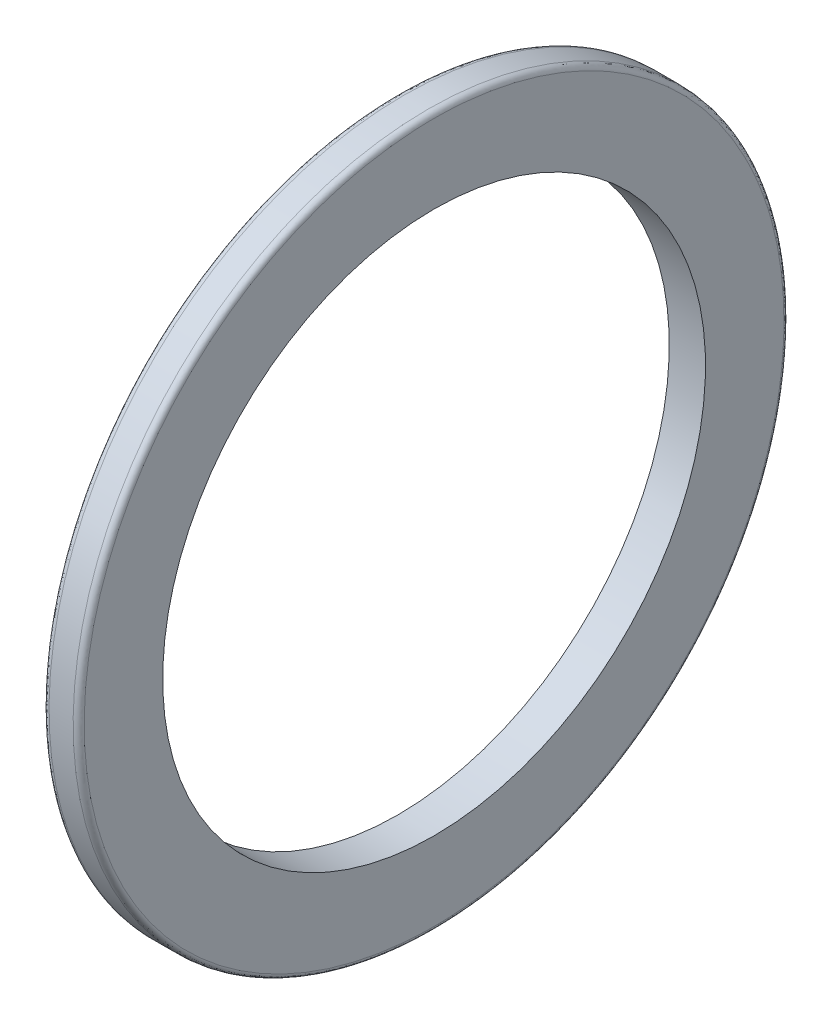
ISO-10303-21;
HEADER;
FILE_DESCRIPTION(('STEP AP214'),'2;1');
FILE_NAME('part.step','',(''),(''),'','','');
FILE_SCHEMA(('AUTOMOTIVE_DESIGN { 1 0 10303 214 1 1 1 1 }'));
ENDSEC;
DATA;
#1=APPLICATION_CONTEXT('core data for automotive mechanical design processes');
#2=APPLICATION_PROTOCOL_DEFINITION('international standard','automotive_design',2000,#1);
#3=PRODUCT_CONTEXT('',#1,'mechanical');
#4=PRODUCT('Part','Part','',(#3));
#5=PRODUCT_RELATED_PRODUCT_CATEGORY('part','',(#4));
#6=PRODUCT_DEFINITION_FORMATION('','',#4);
#7=PRODUCT_DEFINITION_CONTEXT('part definition',#1,'design');
#8=PRODUCT_DEFINITION('design','',#6,#7);
#9=PRODUCT_DEFINITION_SHAPE('','',#8);
#10=(LENGTH_UNIT() NAMED_UNIT(*) SI_UNIT(.MILLI.,.METRE.));
#11=(NAMED_UNIT(*) PLANE_ANGLE_UNIT() SI_UNIT($,.RADIAN.));
#12=(NAMED_UNIT(*) SI_UNIT($,.STERADIAN.) SOLID_ANGLE_UNIT());
#13=UNCERTAINTY_MEASURE_WITH_UNIT(LENGTH_MEASURE(1.E-05),#10,'distance_accuracy_value','');
#14=(GEOMETRIC_REPRESENTATION_CONTEXT(3) GLOBAL_UNCERTAINTY_ASSIGNED_CONTEXT((#13)) GLOBAL_UNIT_ASSIGNED_CONTEXT((#10,
#11,#12)) REPRESENTATION_CONTEXT('',''));
#15=CARTESIAN_POINT('',(0.,0.,0.));
#16=DIRECTION('',(0.,0.,1.));
#17=DIRECTION('',(1.,0.,0.));
#18=AXIS2_PLACEMENT_3D('',#15,#16,#17);
#19=CARTESIAN_POINT('',(117.623751985414,24.7855765613423,30.5708544442854));
#20=DIRECTION('',(-1.,0.,0.));
#21=DIRECTION('',(0.,1.,0.));
#22=AXIS2_PLACEMENT_3D('',#19,#20,#21);
#23=PLANE('',#22);
#24=CARTESIAN_POINT('',(117.623751985414,26.1058697660205,19.9562775900885));
#25=DIRECTION('',(-1.,0.,0.));
#26=DIRECTION('',(0.,-0.813826036051076,-0.581108581114918));
#27=AXIS2_PLACEMENT_3D('',#24,#25,#26);
#28=CIRCLE('',#27,8.29700926115299);
#29=CARTESIAN_POINT('',(117.623751985414,34.4028790271735,19.9562775900885));
#30=VERTEX_POINT('',#29);
#31=EDGE_CURVE('E50',#30,#30,#28,.T.);
#32=ORIENTED_EDGE('',*,*,#31,.F.);
#33=EDGE_LOOP('',(#32));
#34=FACE_BOUND('',#33,.T.);
#35=CARTESIAN_POINT('',(117.623751985414,26.1058697660205,19.9562775900885));
#36=DIRECTION('',(1.,0.,0.));
#37=DIRECTION('',(0.,0.476211165360655,0.879330953615217));
#38=AXIS2_PLACEMENT_3D('',#35,#36,#37);
#39=CIRCLE('',#38,10.6963739622347);
#40=CARTESIAN_POINT('',(117.623751985414,24.7855765613423,30.5708544442854));
#41=VERTEX_POINT('',#40);
#42=EDGE_CURVE('E77',#41,#41,#39,.T.);
#43=ORIENTED_EDGE('',*,*,#42,.F.);
#44=EDGE_LOOP('',(#43));
#45=FACE_BOUND('',#44,.T.);
#46=ADVANCED_FACE('F40',(#34,#45),#23,.T.);
#47=CARTESIAN_POINT('',(118.888874461336,26.1058697660205,19.9562775900885));
#48=DIRECTION('',(-1.,0.,0.));
#49=DIRECTION('',(0.,-1.,0.));
#50=AXIS2_PLACEMENT_3D('',#47,#48,#49);
#51=CYLINDRICAL_SURFACE('',#50,8.29700926115298);
#52=ORIENTED_EDGE('',*,*,#31,.T.);
#53=DIRECTION('',(1.,0.,0.));
#54=VECTOR('',#53,1.);
#55=CARTESIAN_POINT('',(118.888874461336,34.4028790271735,19.9562775900885));
#56=LINE('',#55,#54);
#57=CARTESIAN_POINT('',(118.730433843465,34.4028790271735,19.9562775900885));
#58=VERTEX_POINT('',#57);
#59=EDGE_CURVE('E11',#30,#58,#56,.T.);
#60=ORIENTED_EDGE('',*,*,#59,.T.);
#61=CARTESIAN_POINT('',(118.730433843465,26.1058697660205,19.9562775900885));
#62=DIRECTION('',(-1.,0.,0.));
#63=DIRECTION('',(0.,-0.813826036051075,-0.581108581114919));
#64=AXIS2_PLACEMENT_3D('',#61,#62,#63);
#65=CIRCLE('',#64,8.29700926115298);
#66=EDGE_CURVE('E68',#58,#58,#65,.T.);
#67=ORIENTED_EDGE('',*,*,#66,.F.);
#68=ORIENTED_EDGE('',*,*,#59,.F.);
#69=EDGE_LOOP('',(#52,#60,#67,#68));
#70=FACE_BOUND('',#69,.T.);
#71=ADVANCED_FACE('F42',(#70),#51,.F.);
#72=CARTESIAN_POINT('',(118.545682167081,24.7666666288693,30.7228819869787));
#73=CARTESIAN_POINT('',(118.730433843465,24.7666666288693,30.7228819869788));
#74=CARTESIAN_POINT('',(118.730433843465,24.7855765613423,30.5708544442854));
#75=CARTESIAN_POINT('',(118.545682167081,14.0000622319791,29.3836788498275));
#76=CARTESIAN_POINT('',(118.730433843465,14.0000622319791,29.3836788498276));
#77=CARTESIAN_POINT('',(118.730433843465,14.1709997071453,29.2505612396072));
#78=CARTESIAN_POINT('',(118.545682167081,15.3392653691303,18.6170744529373));
#79=CARTESIAN_POINT('',(118.730433843465,15.3392653691303,18.6170744529373));
#80=CARTESIAN_POINT('',(118.730433843465,15.4912929118236,18.6359843854103));
#81=CARTESIAN_POINT('',(118.545682167081,16.6784685062815,7.85047005604708));
#82=CARTESIAN_POINT('',(118.730433843465,16.6784685062815,7.85047005604705));
#83=CARTESIAN_POINT('',(118.730433843465,16.8115861165018,8.02140753121333));
#84=CARTESIAN_POINT('',(118.545682167081,27.4450729031717,9.18967319319828));
#85=CARTESIAN_POINT('',(118.730433843465,27.4450729031717,9.18967319319824));
#86=CARTESIAN_POINT('',(118.730433843465,27.4261629706988,9.34170073589156));
#87=CARTESIAN_POINT('',(118.545682167081,38.211677300062,10.5288763303495));
#88=CARTESIAN_POINT('',(118.730433843465,38.211677300062,10.5288763303495));
#89=CARTESIAN_POINT('',(118.730433843465,38.0407398248957,10.6619939405698));
#90=CARTESIAN_POINT('',(118.545682167081,36.8724741629107,21.2954807272397));
#91=CARTESIAN_POINT('',(118.730433843465,36.8724741629108,21.2954807272397));
#92=CARTESIAN_POINT('',(118.730433843465,36.7204466202175,21.2765707947667));
#93=CARTESIAN_POINT('',(118.545682167081,35.5332710257595,32.0620851241299));
#94=CARTESIAN_POINT('',(118.730433843465,35.5332710257596,32.06208512413));
#95=CARTESIAN_POINT('',(118.730433843465,35.4001534155392,31.8911476489637));
#96=CARTESIAN_POINT('',(118.545682167081,24.7666666288693,30.7228819869787));
#97=CARTESIAN_POINT('',(118.730433843465,24.7666666288693,30.7228819869788));
#98=CARTESIAN_POINT('',(118.730433843465,24.7855765613423,30.5708544442854));
#99=(BOUNDED_SURFACE() B_SPLINE_SURFACE(2,2,((#72,#73,#74),(#75,#76,#77),(#78,#79,#80),(#81,#82,
#83),(#84,#85,#86),(#87,#88,#89),(#90,#91,#92),(#93,#94,#95),(#96,#97,#98)),.UNSPECIFIED.,.T.,
.F.,.F.) B_SPLINE_SURFACE_WITH_KNOTS((3,2,2,2,3),(3,3),(0.,21.9340743027795,43.868148605559,
65.8022229083385,87.7362972111179),(0.,0.31415926535973),
.UNSPECIFIED.) GEOMETRIC_REPRESENTATION_ITEM() RATIONAL_B_SPLINE_SURFACE(((1.,0.707106781186471,
1.),(0.707106781186548,0.499999999999946,0.707106781186548),(1.,0.707106781186471,1.),
(0.707106781186548,0.499999999999946,0.707106781186548),(1.,0.707106781186471,1.),
(0.707106781186548,0.499999999999946,0.707106781186548),(1.,0.707106781186471,1.),
(0.707106781186548,0.499999999999946,0.707106781186548),(1.,0.707106781186471,1.))) REPRESENTATION_ITEM('') SURFACE());
#100=CARTESIAN_POINT('',(118.545682167081,26.1058697660205,19.9562775900885));
#101=DIRECTION('',(1.,0.,0.));
#102=DIRECTION('',(0.,0.476211165360656,0.879330953615217));
#103=AXIS2_PLACEMENT_3D('',#100,#101,#102);
#104=CIRCLE('',#103,10.8495730460554);
#105=CARTESIAN_POINT('',(118.545682167081,24.7666666288693,30.7228819869787));
#106=VERTEX_POINT('',#105);
#107=EDGE_CURVE('E80',#106,#106,#104,.T.);
#108=CARTESIAN_POINT('',(118.545682167081,24.7855765613423,30.5708544442851));
#109=DIRECTION('',(0.,0.992352818971499,0.123433717757022));
#110=DIRECTION('',(1.,-5.57228464769207E-13,4.71705043640603E-12));
#111=AXIS2_PLACEMENT_3D('',#108,#109,#110);
#112=ELLIPSE('',#111,0.184751676383958,0.153199083820986);
#113=CARTESIAN_POINT('',(118.730433843465,24.7855765613423,30.5708544442854));
#114=VERTEX_POINT('',#113);
#115=EDGE_CURVE('E96',#106,#114,#112,.T.);
#116=CARTESIAN_POINT('',(118.730433843465,26.1058697660205,19.9562775900885));
#117=DIRECTION('',(1.,0.,0.));
#118=DIRECTION('',(0.,0.476211165360656,0.879330953615216));
#119=AXIS2_PLACEMENT_3D('',#116,#117,#118);
#120=CIRCLE('',#119,10.6963739622347);
#121=EDGE_CURVE('E74',#114,#114,#120,.T.);
#122=ORIENTED_EDGE('',*,*,#107,.T.);
#123=ORIENTED_EDGE('',*,*,#115,.T.);
#124=ORIENTED_EDGE('',*,*,#121,.F.);
#125=ORIENTED_EDGE('',*,*,#115,.F.);
#126=EDGE_LOOP('',(#122,#123,#124,#125));
#127=FACE_BOUND('',#126,.T.);
#128=ADVANCED_FACE('F103',(#127),#99,.T.);
#129=CARTESIAN_POINT('',(117.808503661797,24.7666666288693,30.7228819869787));
#130=CARTESIAN_POINT('',(117.808503661797,14.0000622319791,29.3836788498275));
#131=CARTESIAN_POINT('',(117.808503661797,15.3392653691303,18.6170744529373));
#132=CARTESIAN_POINT('',(117.808503661797,16.6784685062815,7.85047005604708));
#133=CARTESIAN_POINT('',(117.808503661797,27.4450729031717,9.18967319319828));
#134=CARTESIAN_POINT('',(117.808503661797,38.211677300062,10.5288763303495));
#135=CARTESIAN_POINT('',(117.808503661797,36.8724741629107,21.2954807272397));
#136=CARTESIAN_POINT('',(117.808503661797,35.5332710257595,32.0620851241299));
#137=CARTESIAN_POINT('',(117.808503661797,24.7666666288693,30.7228819869787));
#138=CARTESIAN_POINT('',(117.623751985414,24.7666666288693,30.7228819869788));
#139=CARTESIAN_POINT('',(117.623751985414,14.0000622319791,29.3836788498276));
#140=CARTESIAN_POINT('',(117.623751985414,15.3392653691303,18.6170744529373));
#141=CARTESIAN_POINT('',(117.623751985414,16.6784685062815,7.85047005604706));
#142=CARTESIAN_POINT('',(117.623751985414,27.4450729031717,9.18967319319825));
#143=CARTESIAN_POINT('',(117.623751985414,38.211677300062,10.5288763303495));
#144=CARTESIAN_POINT('',(117.623751985414,36.8724741629108,21.2954807272397));
#145=CARTESIAN_POINT('',(117.623751985414,35.5332710257596,32.0620851241301));
#146=CARTESIAN_POINT('',(117.623751985414,24.7666666288693,30.7228819869788));
#147=CARTESIAN_POINT('',(117.623751985414,24.7855765613423,30.5708544442854));
#148=CARTESIAN_POINT('',(117.623751985414,14.1709997071453,29.2505612396072));
#149=CARTESIAN_POINT('',(117.623751985414,15.4912929118236,18.6359843854103));
#150=CARTESIAN_POINT('',(117.623751985414,16.8115861165018,8.02140753121333));
#151=CARTESIAN_POINT('',(117.623751985414,27.4261629706988,9.34170073589156));
#152=CARTESIAN_POINT('',(117.623751985414,38.0407398248957,10.6619939405698));
#153=CARTESIAN_POINT('',(117.623751985414,36.7204466202175,21.2765707947667));
#154=CARTESIAN_POINT('',(117.623751985414,35.4001534155392,31.8911476489637));
#155=CARTESIAN_POINT('',(117.623751985414,24.7855765613423,30.5708544442854));
#156=(BOUNDED_SURFACE() B_SPLINE_SURFACE(2,2,((#129,#130,#131,#132,#133,#134,#135,#136,#137),
(#138,#139,#140,#141,#142,#143,#144,#145,#146),(#147,#148,#149,#150,#151,#152,#153,#154,#155)),
.UNSPECIFIED.,.F.,.T.,.F.) B_SPLINE_SURFACE_WITH_KNOTS((3,3),(3,2,2,2,3),(0.,0.314159265359734),
(0.,21.9340743027795,43.868148605559,65.8022229083385,87.736297211118),
.UNSPECIFIED.) GEOMETRIC_REPRESENTATION_ITEM() RATIONAL_B_SPLINE_SURFACE(((1.,0.707106781186548,
1.,0.707106781186548,1.,0.707106781186548,1.,0.707106781186548,1.),(0.707106781186447,
0.499999999999929,0.707106781186447,0.499999999999929,0.707106781186447,0.499999999999929,
0.707106781186447,0.499999999999929,0.707106781186447),(1.,0.707106781186548,1.,
0.707106781186548,1.,0.707106781186548,1.,0.707106781186548,1.))) REPRESENTATION_ITEM('') SURFACE());
#157=CARTESIAN_POINT('',(117.808503661797,24.7855765613422,30.5708544442857));
#158=DIRECTION('',(0.,-0.992352818971499,-0.123433717757022));
#159=DIRECTION('',(1.,-5.21659149883491E-13,3.95682152457781E-12));
#160=AXIS2_PLACEMENT_3D('',#157,#158,#159);
#161=ELLIPSE('',#160,0.184751676383247,0.153199083820357);
#162=CARTESIAN_POINT('',(117.808503661797,24.7666666288693,30.7228819869787));
#163=VERTEX_POINT('',#162);
#164=EDGE_CURVE('E73',#163,#41,#161,.T.);
#165=CARTESIAN_POINT('',(117.808503661797,26.1058697660205,19.9562775900885));
#166=DIRECTION('',(1.,0.,0.));
#167=DIRECTION('',(0.,0.476211165360655,0.879330953615217));
#168=AXIS2_PLACEMENT_3D('',#165,#166,#167);
#169=CIRCLE('',#168,10.8495730460554);
#170=EDGE_CURVE('E44',#163,#163,#169,.T.);
#171=ORIENTED_EDGE('',*,*,#164,.T.);
#172=ORIENTED_EDGE('',*,*,#42,.T.);
#173=ORIENTED_EDGE('',*,*,#164,.F.);
#174=ORIENTED_EDGE('',*,*,#170,.F.);
#175=EDGE_LOOP('',(#171,#172,#173,#174));
#176=FACE_BOUND('',#175,.T.);
#177=ADVANCED_FACE('F93',(#176),#156,.T.);
#178=CARTESIAN_POINT('',(118.730433843465,39.5641252621333,21.6302815115275));
#179=DIRECTION('',(1.,0.,0.));
#180=DIRECTION('',(0.,1.,0.));
#181=AXIS2_PLACEMENT_3D('',#178,#179,#180);
#182=PLANE('',#181);
#183=ORIENTED_EDGE('',*,*,#66,.T.);
#184=EDGE_LOOP('',(#183));
#185=FACE_BOUND('',#184,.T.);
#186=ORIENTED_EDGE('',*,*,#121,.T.);
#187=EDGE_LOOP('',(#186));
#188=FACE_BOUND('',#187,.T.);
#189=ADVANCED_FACE('F71',(#185,#188),#182,.T.);
#190=CARTESIAN_POINT('',(117.623751985414,26.1058697660205,19.9562775900885));
#191=DIRECTION('',(-1.,0.,0.));
#192=DIRECTION('',(0.,0.123433717757041,-0.992352818971496));
#193=AXIS2_PLACEMENT_3D('',#190,#191,#192);
#194=CYLINDRICAL_SURFACE('',#193,10.8495730460554);
#195=ORIENTED_EDGE('',*,*,#170,.T.);
#196=DIRECTION('',(1.,0.,0.));
#197=VECTOR('',#196,1.);
#198=CARTESIAN_POINT('',(117.623751985414,24.7666666288693,30.7228819869787));
#199=LINE('',#198,#197);
#200=EDGE_CURVE('E84',#163,#106,#199,.T.);
#201=ORIENTED_EDGE('',*,*,#200,.T.);
#202=ORIENTED_EDGE('',*,*,#107,.F.);
#203=ORIENTED_EDGE('',*,*,#200,.F.);
#204=EDGE_LOOP('',(#195,#201,#202,#203));
#205=FACE_BOUND('',#204,.T.);
#206=ADVANCED_FACE('F91',(#205),#194,.T.);
#207=CLOSED_SHELL('',(#46,#71,#128,#177,#189,#206));
#208=MANIFOLD_SOLID_BREP('B2',#207);
#209=ADVANCED_BREP_SHAPE_REPRESENTATION('',(#18,#208),#14);
#210=SHAPE_DEFINITION_REPRESENTATION(#9,#209);
ENDSEC;
END-ISO-10303-21;
